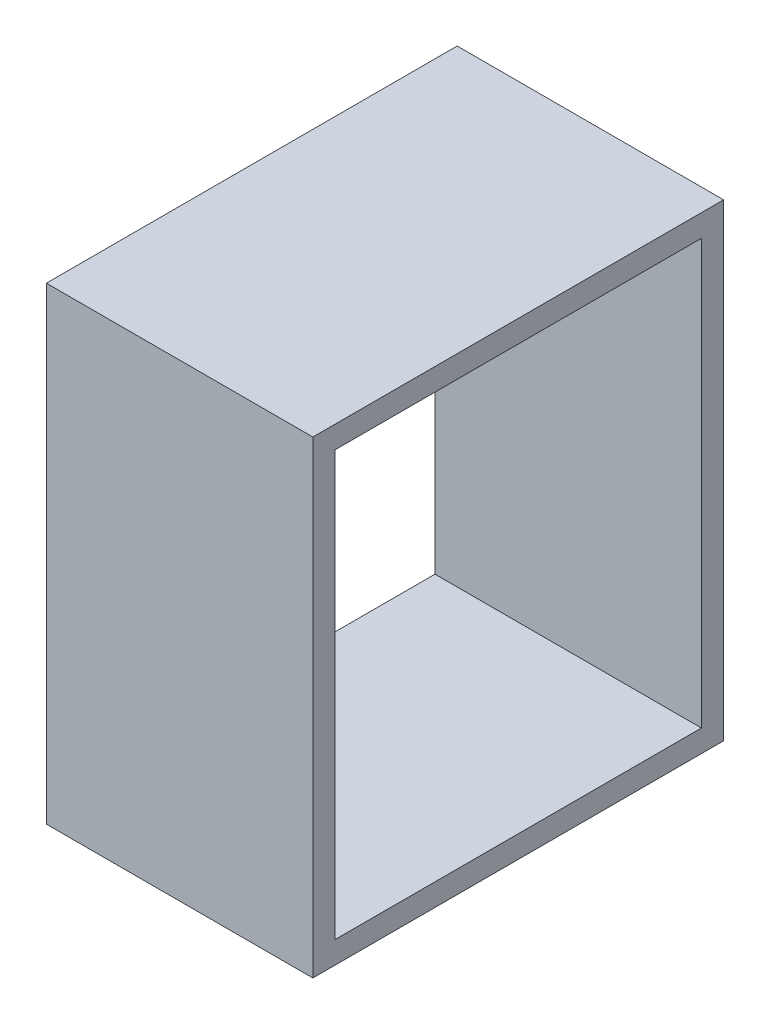
ISO-10303-21;
HEADER;
FILE_DESCRIPTION(('STEP AP214'),'2;1');
FILE_NAME('part.step','',(''),(''),'','','');
FILE_SCHEMA(('AUTOMOTIVE_DESIGN { 1 0 10303 214 1 1 1 1 }'));
ENDSEC;
DATA;
#1=APPLICATION_CONTEXT('core data for automotive mechanical design processes');
#2=APPLICATION_PROTOCOL_DEFINITION('international standard','automotive_design',2000,#1);
#3=PRODUCT_CONTEXT('',#1,'mechanical');
#4=PRODUCT('Part','Part','',(#3));
#5=PRODUCT_RELATED_PRODUCT_CATEGORY('part','',(#4));
#6=PRODUCT_DEFINITION_FORMATION('','',#4);
#7=PRODUCT_DEFINITION_CONTEXT('part definition',#1,'design');
#8=PRODUCT_DEFINITION('design','',#6,#7);
#9=PRODUCT_DEFINITION_SHAPE('','',#8);
#10=(LENGTH_UNIT() NAMED_UNIT(*) SI_UNIT(.MILLI.,.METRE.));
#11=(NAMED_UNIT(*) PLANE_ANGLE_UNIT() SI_UNIT($,.RADIAN.));
#12=(NAMED_UNIT(*) SI_UNIT($,.STERADIAN.) SOLID_ANGLE_UNIT());
#13=UNCERTAINTY_MEASURE_WITH_UNIT(LENGTH_MEASURE(1.E-05),#10,'distance_accuracy_value','');
#14=(GEOMETRIC_REPRESENTATION_CONTEXT(3) GLOBAL_UNCERTAINTY_ASSIGNED_CONTEXT((#13)) GLOBAL_UNIT_ASSIGNED_CONTEXT((#10,
#11,#12)) REPRESENTATION_CONTEXT('',''));
#15=CARTESIAN_POINT('',(0.,0.,0.));
#16=DIRECTION('',(0.,0.,1.));
#17=DIRECTION('',(1.,0.,0.));
#18=AXIS2_PLACEMENT_3D('',#15,#16,#17);
#19=CARTESIAN_POINT('',(-6.,10.55,23.));
#20=DIRECTION('',(1.,0.,0.));
#21=DIRECTION('',(0.,1.,0.));
#22=AXIS2_PLACEMENT_3D('',#19,#20,#21);
#23=PLANE('',#22);
#24=DIRECTION('',(0.,0.,1.));
#25=VECTOR('',#24,1.);
#26=CARTESIAN_POINT('',(-6.,-9.55,23.));
#27=LINE('',#26,#25);
#28=CARTESIAN_POINT('',(-6.,-9.55,24.));
#29=VERTEX_POINT('',#28);
#30=CARTESIAN_POINT('',(-6.,-9.55,40.5));
#31=VERTEX_POINT('',#30);
#32=EDGE_CURVE('E108',#29,#31,#27,.T.);
#33=ORIENTED_EDGE('',*,*,#32,.F.);
#34=DIRECTION('',(0.,-1.,0.));
#35=VECTOR('',#34,1.);
#36=CARTESIAN_POINT('',(-6.,10.55,24.));
#37=LINE('',#36,#35);
#38=CARTESIAN_POINT('',(-6.,9.55,24.));
#39=VERTEX_POINT('',#38);
#40=EDGE_CURVE('E77',#39,#29,#37,.T.);
#41=ORIENTED_EDGE('',*,*,#40,.F.);
#42=DIRECTION('',(0.,0.,1.));
#43=VECTOR('',#42,1.);
#44=CARTESIAN_POINT('',(-6.,9.55,23.));
#45=LINE('',#44,#43);
#46=CARTESIAN_POINT('',(-6.,9.55,40.5));
#47=VERTEX_POINT('',#46);
#48=EDGE_CURVE('E24',#39,#47,#45,.T.);
#49=ORIENTED_EDGE('',*,*,#48,.T.);
#50=DIRECTION('',(0.,-1.,0.));
#51=VECTOR('',#50,1.);
#52=CARTESIAN_POINT('',(-6.,10.55,40.5));
#53=LINE('',#52,#51);
#54=EDGE_CURVE('E107',#47,#31,#53,.T.);
#55=ORIENTED_EDGE('',*,*,#54,.T.);
#56=EDGE_LOOP('',(#33,#41,#49,#55));
#57=FACE_BOUND('',#56,.T.);
#58=DIRECTION('',(0.,1.,0.));
#59=VECTOR('',#58,1.);
#60=CARTESIAN_POINT('',(-6.,-10.55,41.5));
#61=LINE('',#60,#59);
#62=CARTESIAN_POINT('',(-6.,-10.55,41.5));
#63=VERTEX_POINT('',#62);
#64=CARTESIAN_POINT('',(-6.,10.55,41.5));
#65=VERTEX_POINT('',#64);
#66=EDGE_CURVE('E9',#63,#65,#61,.T.);
#67=ORIENTED_EDGE('',*,*,#66,.T.);
#68=DIRECTION('',(0.,0.,-1.));
#69=VECTOR('',#68,1.);
#70=CARTESIAN_POINT('',(-6.,10.55,41.5));
#71=LINE('',#70,#69);
#72=CARTESIAN_POINT('',(-6.,10.55,23.));
#73=VERTEX_POINT('',#72);
#74=EDGE_CURVE('E264',#65,#73,#71,.T.);
#75=ORIENTED_EDGE('',*,*,#74,.T.);
#76=DIRECTION('',(0.,-1.,0.));
#77=VECTOR('',#76,1.);
#78=CARTESIAN_POINT('',(-6.,10.55,23.));
#79=LINE('',#78,#77);
#80=CARTESIAN_POINT('',(-6.,-10.55,23.));
#81=VERTEX_POINT('',#80);
#82=EDGE_CURVE('E277',#73,#81,#79,.T.);
#83=ORIENTED_EDGE('',*,*,#82,.T.);
#84=DIRECTION('',(0.,0.,-1.));
#85=VECTOR('',#84,1.);
#86=CARTESIAN_POINT('',(-6.,-10.55,41.5));
#87=LINE('',#86,#85);
#88=EDGE_CURVE('E273',#63,#81,#87,.T.);
#89=ORIENTED_EDGE('',*,*,#88,.F.);
#90=EDGE_LOOP('',(#67,#75,#83,#89));
#91=FACE_BOUND('',#90,.T.);
#92=ADVANCED_FACE('F15',(#57,#91),#23,.F.);
#93=CARTESIAN_POINT('',(0.,-10.05,41.5));
#94=DIRECTION('',(0.,0.,1.));
#95=DIRECTION('',(1.,0.,0.));
#96=AXIS2_PLACEMENT_3D('',#93,#94,#95);
#97=PLANE('',#96);
#98=DIRECTION('',(1.,0.,0.));
#99=VECTOR('',#98,1.);
#100=CARTESIAN_POINT('',(-6.,-10.55,41.5));
#101=LINE('',#100,#99);
#102=CARTESIAN_POINT('',(6.,-10.55,41.5));
#103=VERTEX_POINT('',#102);
#104=EDGE_CURVE('E258',#63,#103,#101,.T.);
#105=ORIENTED_EDGE('',*,*,#104,.T.);
#106=DIRECTION('',(0.,-1.,0.));
#107=VECTOR('',#106,1.);
#108=CARTESIAN_POINT('',(6.,10.55,41.5));
#109=LINE('',#108,#107);
#110=CARTESIAN_POINT('',(6.,10.55,41.5));
#111=VERTEX_POINT('',#110);
#112=EDGE_CURVE('E94',#111,#103,#109,.T.);
#113=ORIENTED_EDGE('',*,*,#112,.F.);
#114=DIRECTION('',(-1.,0.,0.));
#115=VECTOR('',#114,1.);
#116=CARTESIAN_POINT('',(6.,10.55,41.5));
#117=LINE('',#116,#115);
#118=EDGE_CURVE('E251',#111,#65,#117,.T.);
#119=ORIENTED_EDGE('',*,*,#118,.T.);
#120=ORIENTED_EDGE('',*,*,#66,.F.);
#121=EDGE_LOOP('',(#105,#113,#119,#120));
#122=FACE_BOUND('',#121,.T.);
#123=ADVANCED_FACE('F183',(#122),#97,.T.);
#124=CARTESIAN_POINT('',(-6.,9.55,23.));
#125=DIRECTION('',(0.,1.,0.));
#126=DIRECTION('',(1.,0.,0.));
#127=AXIS2_PLACEMENT_3D('',#124,#125,#126);
#128=PLANE('',#127);
#129=DIRECTION('',(1.,0.,0.));
#130=VECTOR('',#129,1.);
#131=CARTESIAN_POINT('',(-3.,9.55,40.5));
#132=LINE('',#131,#130);
#133=CARTESIAN_POINT('',(6.,9.55,40.5));
#134=VERTEX_POINT('',#133);
#135=EDGE_CURVE('E104',#47,#134,#132,.T.);
#136=ORIENTED_EDGE('',*,*,#135,.F.);
#137=ORIENTED_EDGE('',*,*,#48,.F.);
#138=DIRECTION('',(-1.,0.,0.));
#139=VECTOR('',#138,1.);
#140=CARTESIAN_POINT('',(-3.,9.55,24.));
#141=LINE('',#140,#139);
#142=CARTESIAN_POINT('',(6.,9.55,24.));
#143=VERTEX_POINT('',#142);
#144=EDGE_CURVE('E68',#143,#39,#141,.T.);
#145=ORIENTED_EDGE('',*,*,#144,.F.);
#146=DIRECTION('',(0.,0.,1.));
#147=VECTOR('',#146,1.);
#148=CARTESIAN_POINT('',(6.,9.55,23.));
#149=LINE('',#148,#147);
#150=EDGE_CURVE('E71',#143,#134,#149,.T.);
#151=ORIENTED_EDGE('',*,*,#150,.T.);
#152=EDGE_LOOP('',(#136,#137,#145,#151));
#153=FACE_BOUND('',#152,.T.);
#154=ADVANCED_FACE('F75',(#153),#128,.F.);
#155=CARTESIAN_POINT('',(0.,0.,40.5));
#156=DIRECTION('',(0.,0.,1.));
#157=DIRECTION('',(1.,0.,0.));
#158=AXIS2_PLACEMENT_3D('',#155,#156,#157);
#159=PLANE('',#158);
#160=ORIENTED_EDGE('',*,*,#135,.T.);
#161=DIRECTION('',(0.,1.,0.));
#162=VECTOR('',#161,1.);
#163=CARTESIAN_POINT('',(6.,-10.55,40.5));
#164=LINE('',#163,#162);
#165=CARTESIAN_POINT('',(6.,-9.55,40.5));
#166=VERTEX_POINT('',#165);
#167=EDGE_CURVE('E88',#166,#134,#164,.T.);
#168=ORIENTED_EDGE('',*,*,#167,.F.);
#169=DIRECTION('',(-1.,0.,0.));
#170=VECTOR('',#169,1.);
#171=CARTESIAN_POINT('',(3.,-9.55,40.5));
#172=LINE('',#171,#170);
#173=EDGE_CURVE('E57',#166,#31,#172,.T.);
#174=ORIENTED_EDGE('',*,*,#173,.T.);
#175=ORIENTED_EDGE('',*,*,#54,.F.);
#176=EDGE_LOOP('',(#160,#168,#174,#175));
#177=FACE_BOUND('',#176,.T.);
#178=ADVANCED_FACE('F130',(#177),#159,.F.);
#179=CARTESIAN_POINT('',(6.,-9.55,23.));
#180=DIRECTION('',(0.,-1.,0.));
#181=DIRECTION('',(0.,0.,-1.));
#182=AXIS2_PLACEMENT_3D('',#179,#180,#181);
#183=PLANE('',#182);
#184=ORIENTED_EDGE('',*,*,#173,.F.);
#185=DIRECTION('',(0.,0.,1.));
#186=VECTOR('',#185,1.);
#187=CARTESIAN_POINT('',(6.,-9.55,23.));
#188=LINE('',#187,#186);
#189=CARTESIAN_POINT('',(6.,-9.55,24.));
#190=VERTEX_POINT('',#189);
#191=EDGE_CURVE('E91',#190,#166,#188,.T.);
#192=ORIENTED_EDGE('',*,*,#191,.F.);
#193=DIRECTION('',(1.,0.,0.));
#194=VECTOR('',#193,1.);
#195=CARTESIAN_POINT('',(3.,-9.55,24.));
#196=LINE('',#195,#194);
#197=EDGE_CURVE('E93',#29,#190,#196,.T.);
#198=ORIENTED_EDGE('',*,*,#197,.F.);
#199=ORIENTED_EDGE('',*,*,#32,.T.);
#200=EDGE_LOOP('',(#184,#192,#198,#199));
#201=FACE_BOUND('',#200,.T.);
#202=ADVANCED_FACE('F131',(#201),#183,.F.);
#203=CARTESIAN_POINT('',(0.,0.,24.));
#204=DIRECTION('',(0.,0.,1.));
#205=DIRECTION('',(1.,0.,0.));
#206=AXIS2_PLACEMENT_3D('',#203,#204,#205);
#207=PLANE('',#206);
#208=ORIENTED_EDGE('',*,*,#144,.T.);
#209=ORIENTED_EDGE('',*,*,#40,.T.);
#210=ORIENTED_EDGE('',*,*,#197,.T.);
#211=DIRECTION('',(0.,1.,0.));
#212=VECTOR('',#211,1.);
#213=CARTESIAN_POINT('',(6.,-10.55,24.));
#214=LINE('',#213,#212);
#215=EDGE_CURVE('E84',#190,#143,#214,.T.);
#216=ORIENTED_EDGE('',*,*,#215,.T.);
#217=EDGE_LOOP('',(#208,#209,#210,#216));
#218=FACE_BOUND('',#217,.T.);
#219=ADVANCED_FACE('F90',(#218),#207,.T.);
#220=CARTESIAN_POINT('',(6.,-10.55,23.));
#221=DIRECTION('',(-1.,0.,0.));
#222=DIRECTION('',(0.,0.,1.));
#223=AXIS2_PLACEMENT_3D('',#220,#221,#222);
#224=PLANE('',#223);
#225=ORIENTED_EDGE('',*,*,#215,.F.);
#226=ORIENTED_EDGE('',*,*,#191,.T.);
#227=ORIENTED_EDGE('',*,*,#167,.T.);
#228=ORIENTED_EDGE('',*,*,#150,.F.);
#229=EDGE_LOOP('',(#225,#226,#227,#228));
#230=FACE_BOUND('',#229,.T.);
#231=DIRECTION('',(0.,0.,1.));
#232=VECTOR('',#231,1.);
#233=CARTESIAN_POINT('',(6.,-10.55,23.));
#234=LINE('',#233,#232);
#235=CARTESIAN_POINT('',(6.,-10.55,23.));
#236=VERTEX_POINT('',#235);
#237=EDGE_CURVE('E288',#236,#103,#234,.T.);
#238=ORIENTED_EDGE('',*,*,#237,.F.);
#239=DIRECTION('',(0.,1.,0.));
#240=VECTOR('',#239,1.);
#241=CARTESIAN_POINT('',(6.,-10.55,23.));
#242=LINE('',#241,#240);
#243=CARTESIAN_POINT('',(6.,10.55,23.));
#244=VERTEX_POINT('',#243);
#245=EDGE_CURVE('E257',#236,#244,#242,.T.);
#246=ORIENTED_EDGE('',*,*,#245,.T.);
#247=DIRECTION('',(0.,0.,1.));
#248=VECTOR('',#247,1.);
#249=CARTESIAN_POINT('',(6.,10.55,23.));
#250=LINE('',#249,#248);
#251=EDGE_CURVE('E101',#244,#111,#250,.T.);
#252=ORIENTED_EDGE('',*,*,#251,.T.);
#253=ORIENTED_EDGE('',*,*,#112,.T.);
#254=EDGE_LOOP('',(#238,#246,#252,#253));
#255=FACE_BOUND('',#254,.T.);
#256=ADVANCED_FACE('F85',(#230,#255),#224,.F.);
#257=CARTESIAN_POINT('',(6.,10.55,23.));
#258=DIRECTION('',(0.,-1.,0.));
#259=DIRECTION('',(0.,0.,-1.));
#260=AXIS2_PLACEMENT_3D('',#257,#258,#259);
#261=PLANE('',#260);
#262=ORIENTED_EDGE('',*,*,#74,.F.);
#263=ORIENTED_EDGE('',*,*,#118,.F.);
#264=ORIENTED_EDGE('',*,*,#251,.F.);
#265=DIRECTION('',(-1.,0.,0.));
#266=VECTOR('',#265,1.);
#267=CARTESIAN_POINT('',(6.,10.55,23.));
#268=LINE('',#267,#266);
#269=EDGE_CURVE('E279',#244,#73,#268,.T.);
#270=ORIENTED_EDGE('',*,*,#269,.T.);
#271=EDGE_LOOP('',(#262,#263,#264,#270));
#272=FACE_BOUND('',#271,.T.);
#273=ADVANCED_FACE('F147',(#272),#261,.F.);
#274=CARTESIAN_POINT('',(0.,0.,23.));
#275=DIRECTION('',(0.,0.,1.));
#276=DIRECTION('',(1.,0.,0.));
#277=AXIS2_PLACEMENT_3D('',#274,#275,#276);
#278=PLANE('',#277);
#279=ORIENTED_EDGE('',*,*,#82,.F.);
#280=ORIENTED_EDGE('',*,*,#269,.F.);
#281=ORIENTED_EDGE('',*,*,#245,.F.);
#282=DIRECTION('',(1.,0.,0.));
#283=VECTOR('',#282,1.);
#284=CARTESIAN_POINT('',(-6.,-10.55,23.));
#285=LINE('',#284,#283);
#286=EDGE_CURVE('E295',#81,#236,#285,.T.);
#287=ORIENTED_EDGE('',*,*,#286,.F.);
#288=EDGE_LOOP('',(#279,#280,#281,#287));
#289=FACE_BOUND('',#288,.T.);
#290=ADVANCED_FACE('F145',(#289),#278,.F.);
#291=CARTESIAN_POINT('',(-6.,-10.55,23.));
#292=DIRECTION('',(0.,1.,0.));
#293=DIRECTION('',(1.,0.,0.));
#294=AXIS2_PLACEMENT_3D('',#291,#292,#293);
#295=PLANE('',#294);
#296=ORIENTED_EDGE('',*,*,#286,.T.);
#297=ORIENTED_EDGE('',*,*,#237,.T.);
#298=ORIENTED_EDGE('',*,*,#104,.F.);
#299=ORIENTED_EDGE('',*,*,#88,.T.);
#300=EDGE_LOOP('',(#296,#297,#298,#299));
#301=FACE_BOUND('',#300,.T.);
#302=ADVANCED_FACE('F137',(#301),#295,.F.);
#303=CLOSED_SHELL('',(#92,#123,#154,#178,#202,#219,#256,#273,#290,#302));
#304=MANIFOLD_SOLID_BREP('B1',#303);
#305=ADVANCED_BREP_SHAPE_REPRESENTATION('',(#18,#304),#14);
#306=SHAPE_DEFINITION_REPRESENTATION(#9,#305);
ENDSEC;
END-ISO-10303-21;
